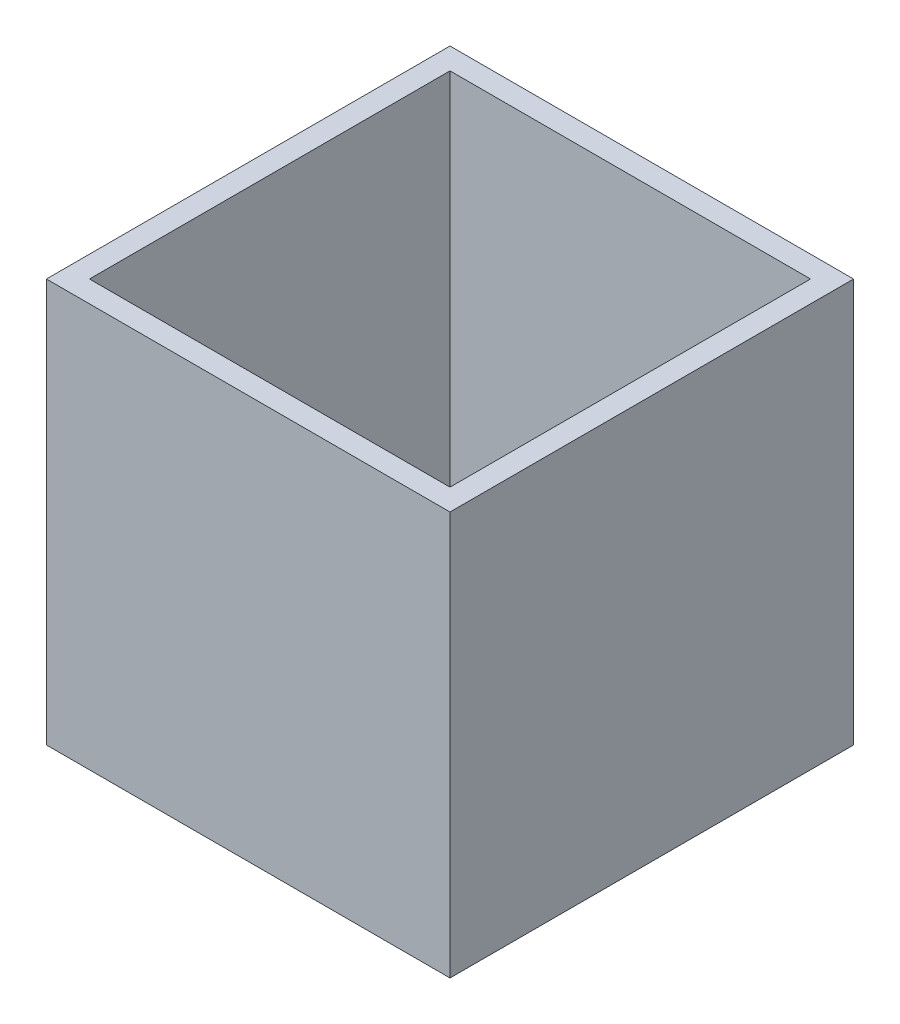
ISO-10303-21;
HEADER;
FILE_DESCRIPTION(('STEP AP214'),'2;1');
FILE_NAME('part.step','',(''),(''),'','','');
FILE_SCHEMA(('AUTOMOTIVE_DESIGN { 1 0 10303 214 1 1 1 1 }'));
ENDSEC;
DATA;
#1=APPLICATION_CONTEXT('core data for automotive mechanical design processes');
#2=APPLICATION_PROTOCOL_DEFINITION('international standard','automotive_design',2000,#1);
#3=PRODUCT_CONTEXT('',#1,'mechanical');
#4=PRODUCT('Part','Part','',(#3));
#5=PRODUCT_RELATED_PRODUCT_CATEGORY('part','',(#4));
#6=PRODUCT_DEFINITION_FORMATION('','',#4);
#7=PRODUCT_DEFINITION_CONTEXT('part definition',#1,'design');
#8=PRODUCT_DEFINITION('design','',#6,#7);
#9=PRODUCT_DEFINITION_SHAPE('','',#8);
#10=(LENGTH_UNIT() NAMED_UNIT(*) SI_UNIT(.MILLI.,.METRE.));
#11=(NAMED_UNIT(*) PLANE_ANGLE_UNIT() SI_UNIT($,.RADIAN.));
#12=(NAMED_UNIT(*) SI_UNIT($,.STERADIAN.) SOLID_ANGLE_UNIT());
#13=UNCERTAINTY_MEASURE_WITH_UNIT(LENGTH_MEASURE(1.E-05),#10,'distance_accuracy_value','');
#14=(GEOMETRIC_REPRESENTATION_CONTEXT(3) GLOBAL_UNCERTAINTY_ASSIGNED_CONTEXT((#13)) GLOBAL_UNIT_ASSIGNED_CONTEXT((#10,
#11,#12)) REPRESENTATION_CONTEXT('',''));
#15=CARTESIAN_POINT('',(0.,0.,0.));
#16=DIRECTION('',(0.,0.,1.));
#17=DIRECTION('',(1.,0.,0.));
#18=AXIS2_PLACEMENT_3D('',#15,#16,#17);
#19=CARTESIAN_POINT('',(0.,150.,0.));
#20=DIRECTION('',(1.,0.,0.));
#21=DIRECTION('',(0.,0.,-1.));
#22=AXIS2_PLACEMENT_3D('',#19,#20,#21);
#23=PLANE('',#22);
#24=DIRECTION('',(0.,0.,1.));
#25=VECTOR('',#24,1.);
#26=CARTESIAN_POINT('',(0.,0.,0.));
#27=LINE('',#26,#25);
#28=CARTESIAN_POINT('',(0.,0.,-150.));
#29=VERTEX_POINT('',#28);
#30=CARTESIAN_POINT('',(0.,0.,0.));
#31=VERTEX_POINT('',#30);
#32=EDGE_CURVE('E166',#29,#31,#27,.T.);
#33=ORIENTED_EDGE('',*,*,#32,.T.);
#34=DIRECTION('',(0.,-1.,0.));
#35=VECTOR('',#34,1.);
#36=CARTESIAN_POINT('',(0.,150.,0.));
#37=LINE('',#36,#35);
#38=CARTESIAN_POINT('',(0.,150.,0.));
#39=VERTEX_POINT('',#38);
#40=EDGE_CURVE('E12',#39,#31,#37,.T.);
#41=ORIENTED_EDGE('',*,*,#40,.F.);
#42=DIRECTION('',(0.,0.,1.));
#43=VECTOR('',#42,1.);
#44=CARTESIAN_POINT('',(0.,150.,0.));
#45=LINE('',#44,#43);
#46=CARTESIAN_POINT('',(0.,150.,-150.));
#47=VERTEX_POINT('',#46);
#48=EDGE_CURVE('E167',#47,#39,#45,.T.);
#49=ORIENTED_EDGE('',*,*,#48,.F.);
#50=DIRECTION('',(0.,-1.,0.));
#51=VECTOR('',#50,1.);
#52=CARTESIAN_POINT('',(0.,150.,-150.));
#53=LINE('',#52,#51);
#54=EDGE_CURVE('E177',#47,#29,#53,.T.);
#55=ORIENTED_EDGE('',*,*,#54,.T.);
#56=EDGE_LOOP('',(#33,#41,#49,#55));
#57=FACE_BOUND('',#56,.T.);
#58=ADVANCED_FACE('F45',(#57),#23,.F.);
#59=CARTESIAN_POINT('',(0.,150.,0.));
#60=DIRECTION('',(0.,0.,-1.));
#61=DIRECTION('',(-1.,0.,0.));
#62=AXIS2_PLACEMENT_3D('',#59,#60,#61);
#63=PLANE('',#62);
#64=DIRECTION('',(1.,0.,0.));
#65=VECTOR('',#64,1.);
#66=CARTESIAN_POINT('',(0.,0.,0.));
#67=LINE('',#66,#65);
#68=CARTESIAN_POINT('',(150.,0.,0.));
#69=VERTEX_POINT('',#68);
#70=EDGE_CURVE('E181',#31,#69,#67,.T.);
#71=ORIENTED_EDGE('',*,*,#70,.T.);
#72=DIRECTION('',(0.,-1.,0.));
#73=VECTOR('',#72,1.);
#74=CARTESIAN_POINT('',(150.,150.,0.));
#75=LINE('',#74,#73);
#76=CARTESIAN_POINT('',(150.,150.,0.));
#77=VERTEX_POINT('',#76);
#78=EDGE_CURVE('E53',#77,#69,#75,.T.);
#79=ORIENTED_EDGE('',*,*,#78,.F.);
#80=DIRECTION('',(1.,0.,0.));
#81=VECTOR('',#80,1.);
#82=CARTESIAN_POINT('',(0.,150.,0.));
#83=LINE('',#82,#81);
#84=EDGE_CURVE('E97',#39,#77,#83,.T.);
#85=ORIENTED_EDGE('',*,*,#84,.F.);
#86=ORIENTED_EDGE('',*,*,#40,.T.);
#87=EDGE_LOOP('',(#71,#79,#85,#86));
#88=FACE_BOUND('',#87,.T.);
#89=ADVANCED_FACE('F216',(#88),#63,.F.);
#90=CARTESIAN_POINT('',(150.,150.,0.));
#91=DIRECTION('',(-1.,0.,0.));
#92=DIRECTION('',(0.,0.,1.));
#93=AXIS2_PLACEMENT_3D('',#90,#91,#92);
#94=PLANE('',#93);
#95=DIRECTION('',(0.,0.,-1.));
#96=VECTOR('',#95,1.);
#97=CARTESIAN_POINT('',(150.,0.,0.));
#98=LINE('',#97,#96);
#99=CARTESIAN_POINT('',(150.,0.,-150.));
#100=VERTEX_POINT('',#99);
#101=EDGE_CURVE('E184',#69,#100,#98,.T.);
#102=ORIENTED_EDGE('',*,*,#101,.T.);
#103=DIRECTION('',(0.,-1.,0.));
#104=VECTOR('',#103,1.);
#105=CARTESIAN_POINT('',(150.,150.,-150.));
#106=LINE('',#105,#104);
#107=CARTESIAN_POINT('',(150.,150.,-150.));
#108=VERTEX_POINT('',#107);
#109=EDGE_CURVE('E191',#108,#100,#106,.T.);
#110=ORIENTED_EDGE('',*,*,#109,.F.);
#111=DIRECTION('',(0.,0.,-1.));
#112=VECTOR('',#111,1.);
#113=CARTESIAN_POINT('',(150.,150.,0.));
#114=LINE('',#113,#112);
#115=EDGE_CURVE('E172',#77,#108,#114,.T.);
#116=ORIENTED_EDGE('',*,*,#115,.F.);
#117=ORIENTED_EDGE('',*,*,#78,.T.);
#118=EDGE_LOOP('',(#102,#110,#116,#117));
#119=FACE_BOUND('',#118,.T.);
#120=ADVANCED_FACE('F198',(#119),#94,.F.);
#121=CARTESIAN_POINT('',(0.,150.,-150.));
#122=DIRECTION('',(0.,0.,1.));
#123=DIRECTION('',(1.,0.,0.));
#124=AXIS2_PLACEMENT_3D('',#121,#122,#123);
#125=PLANE('',#124);
#126=DIRECTION('',(-1.,0.,0.));
#127=VECTOR('',#126,1.);
#128=CARTESIAN_POINT('',(0.,0.,-150.));
#129=LINE('',#128,#127);
#130=EDGE_CURVE('E90',#100,#29,#129,.T.);
#131=ORIENTED_EDGE('',*,*,#130,.T.);
#132=ORIENTED_EDGE('',*,*,#54,.F.);
#133=DIRECTION('',(-1.,0.,0.));
#134=VECTOR('',#133,1.);
#135=CARTESIAN_POINT('',(0.,150.,-150.));
#136=LINE('',#135,#134);
#137=EDGE_CURVE('E69',#108,#47,#136,.T.);
#138=ORIENTED_EDGE('',*,*,#137,.F.);
#139=ORIENTED_EDGE('',*,*,#109,.T.);
#140=EDGE_LOOP('',(#131,#132,#138,#139));
#141=FACE_BOUND('',#140,.T.);
#142=ADVANCED_FACE('F206',(#141),#125,.F.);
#143=CARTESIAN_POINT('',(0.,150.,0.));
#144=DIRECTION('',(0.,-1.,0.));
#145=DIRECTION('',(0.,0.,-1.));
#146=AXIS2_PLACEMENT_3D('',#143,#144,#145);
#147=PLANE('',#146);
#148=DIRECTION('',(0.,0.,-1.));
#149=VECTOR('',#148,1.);
#150=CARTESIAN_POINT('',(142.,150.,-142.));
#151=LINE('',#150,#149);
#152=CARTESIAN_POINT('',(142.,150.,-7.99999999999999));
#153=VERTEX_POINT('',#152);
#154=CARTESIAN_POINT('',(142.,150.,-142.));
#155=VERTEX_POINT('',#154);
#156=EDGE_CURVE('E147',#153,#155,#151,.T.);
#157=ORIENTED_EDGE('',*,*,#156,.F.);
#158=DIRECTION('',(1.,0.,0.));
#159=VECTOR('',#158,1.);
#160=CARTESIAN_POINT('',(142.,150.,-7.99999999999999));
#161=LINE('',#160,#159);
#162=CARTESIAN_POINT('',(7.99999999999995,150.,-7.99999999999999));
#163=VERTEX_POINT('',#162);
#164=EDGE_CURVE('E137',#163,#153,#161,.T.);
#165=ORIENTED_EDGE('',*,*,#164,.F.);
#166=DIRECTION('',(0.,0.,1.));
#167=VECTOR('',#166,1.);
#168=CARTESIAN_POINT('',(7.99999999999998,150.,-142.));
#169=LINE('',#168,#167);
#170=CARTESIAN_POINT('',(7.99999999999998,150.,-142.));
#171=VERTEX_POINT('',#170);
#172=EDGE_CURVE('E151',#171,#163,#169,.T.);
#173=ORIENTED_EDGE('',*,*,#172,.F.);
#174=DIRECTION('',(-1.,0.,0.));
#175=VECTOR('',#174,1.);
#176=CARTESIAN_POINT('',(142.,150.,-142.));
#177=LINE('',#176,#175);
#178=EDGE_CURVE('E60',#155,#171,#177,.T.);
#179=ORIENTED_EDGE('',*,*,#178,.F.);
#180=EDGE_LOOP('',(#157,#165,#173,#179));
#181=FACE_BOUND('',#180,.T.);
#182=ORIENTED_EDGE('',*,*,#48,.T.);
#183=ORIENTED_EDGE('',*,*,#84,.T.);
#184=ORIENTED_EDGE('',*,*,#115,.T.);
#185=ORIENTED_EDGE('',*,*,#137,.T.);
#186=EDGE_LOOP('',(#182,#183,#184,#185));
#187=FACE_BOUND('',#186,.T.);
#188=ADVANCED_FACE('F208',(#181,#187),#147,.F.);
#189=CARTESIAN_POINT('',(0.,0.,0.));
#190=DIRECTION('',(0.,-1.,0.));
#191=DIRECTION('',(0.,0.,-1.));
#192=AXIS2_PLACEMENT_3D('',#189,#190,#191);
#193=PLANE('',#192);
#194=ORIENTED_EDGE('',*,*,#32,.F.);
#195=ORIENTED_EDGE('',*,*,#130,.F.);
#196=ORIENTED_EDGE('',*,*,#101,.F.);
#197=ORIENTED_EDGE('',*,*,#70,.F.);
#198=EDGE_LOOP('',(#194,#195,#196,#197));
#199=FACE_BOUND('',#198,.T.);
#200=ADVANCED_FACE('F202',(#199),#193,.T.);
#201=CARTESIAN_POINT('',(0.,8.00000000000001,0.));
#202=DIRECTION('',(0.,-1.,0.));
#203=DIRECTION('',(0.,0.,-1.));
#204=AXIS2_PLACEMENT_3D('',#201,#202,#203);
#205=PLANE('',#204);
#206=DIRECTION('',(0.,0.,1.));
#207=VECTOR('',#206,1.);
#208=CARTESIAN_POINT('',(7.99999999999998,8.00000000000001,-142.));
#209=LINE('',#208,#207);
#210=CARTESIAN_POINT('',(7.99999999999998,8.00000000000001,-142.));
#211=VERTEX_POINT('',#210);
#212=CARTESIAN_POINT('',(7.99999999999995,8.00000000000001,-7.99999999999999));
#213=VERTEX_POINT('',#212);
#214=EDGE_CURVE('E142',#211,#213,#209,.T.);
#215=ORIENTED_EDGE('',*,*,#214,.T.);
#216=DIRECTION('',(1.,0.,0.));
#217=VECTOR('',#216,1.);
#218=CARTESIAN_POINT('',(142.,8.00000000000001,-7.99999999999999));
#219=LINE('',#218,#217);
#220=CARTESIAN_POINT('',(142.,7.9999999999999,-7.99999999999999));
#221=VERTEX_POINT('',#220);
#222=EDGE_CURVE('E134',#213,#221,#219,.T.);
#223=ORIENTED_EDGE('',*,*,#222,.T.);
#224=DIRECTION('',(0.,0.,-1.));
#225=VECTOR('',#224,1.);
#226=CARTESIAN_POINT('',(142.,8.00000000000001,-142.));
#227=LINE('',#226,#225);
#228=CARTESIAN_POINT('',(142.,8.00000000000001,-142.));
#229=VERTEX_POINT('',#228);
#230=EDGE_CURVE('E120',#221,#229,#227,.T.);
#231=ORIENTED_EDGE('',*,*,#230,.T.);
#232=DIRECTION('',(-1.,0.,0.));
#233=VECTOR('',#232,1.);
#234=CARTESIAN_POINT('',(142.,8.00000000000001,-142.));
#235=LINE('',#234,#233);
#236=EDGE_CURVE('E157',#229,#211,#235,.T.);
#237=ORIENTED_EDGE('',*,*,#236,.T.);
#238=EDGE_LOOP('',(#215,#223,#231,#237));
#239=FACE_BOUND('',#238,.T.);
#240=ADVANCED_FACE('F141',(#239),#205,.F.);
#241=CARTESIAN_POINT('',(142.,-323.504617357995,-7.99999999999999));
#242=DIRECTION('',(0.,0.,1.));
#243=DIRECTION('',(1.,0.,0.));
#244=AXIS2_PLACEMENT_3D('',#241,#242,#243);
#245=PLANE('',#244);
#246=DIRECTION('',(0.,1.,0.));
#247=VECTOR('',#246,1.);
#248=CARTESIAN_POINT('',(7.99999999999995,-323.504617357995,-7.99999999999999));
#249=LINE('',#248,#247);
#250=EDGE_CURVE('E155',#213,#163,#249,.T.);
#251=ORIENTED_EDGE('',*,*,#250,.T.);
#252=ORIENTED_EDGE('',*,*,#164,.T.);
#253=DIRECTION('',(0.,1.,0.));
#254=VECTOR('',#253,1.);
#255=CARTESIAN_POINT('',(142.,-323.504617357995,-7.99999999999999));
#256=LINE('',#255,#254);
#257=EDGE_CURVE('E124',#221,#153,#256,.T.);
#258=ORIENTED_EDGE('',*,*,#257,.F.);
#259=ORIENTED_EDGE('',*,*,#222,.F.);
#260=EDGE_LOOP('',(#251,#252,#258,#259));
#261=FACE_BOUND('',#260,.T.);
#262=ADVANCED_FACE('F133',(#261),#245,.F.);
#263=CARTESIAN_POINT('',(142.,-323.504617357995,-142.));
#264=DIRECTION('',(1.,0.,0.));
#265=DIRECTION('',(0.,0.,-1.));
#266=AXIS2_PLACEMENT_3D('',#263,#264,#265);
#267=PLANE('',#266);
#268=ORIENTED_EDGE('',*,*,#257,.T.);
#269=ORIENTED_EDGE('',*,*,#156,.T.);
#270=DIRECTION('',(0.,1.,0.));
#271=VECTOR('',#270,1.);
#272=CARTESIAN_POINT('',(142.,-323.504617357995,-142.));
#273=LINE('',#272,#271);
#274=EDGE_CURVE('E126',#229,#155,#273,.T.);
#275=ORIENTED_EDGE('',*,*,#274,.F.);
#276=ORIENTED_EDGE('',*,*,#230,.F.);
#277=EDGE_LOOP('',(#268,#269,#275,#276));
#278=FACE_BOUND('',#277,.T.);
#279=ADVANCED_FACE('F122',(#278),#267,.F.);
#280=CARTESIAN_POINT('',(142.,-323.504617357995,-142.));
#281=DIRECTION('',(0.,0.,-1.));
#282=DIRECTION('',(-1.,0.,0.));
#283=AXIS2_PLACEMENT_3D('',#280,#281,#282);
#284=PLANE('',#283);
#285=ORIENTED_EDGE('',*,*,#274,.T.);
#286=ORIENTED_EDGE('',*,*,#178,.T.);
#287=DIRECTION('',(0.,1.,0.));
#288=VECTOR('',#287,1.);
#289=CARTESIAN_POINT('',(7.99999999999998,-323.504617357995,-142.));
#290=LINE('',#289,#288);
#291=EDGE_CURVE('E156',#211,#171,#290,.T.);
#292=ORIENTED_EDGE('',*,*,#291,.F.);
#293=ORIENTED_EDGE('',*,*,#236,.F.);
#294=EDGE_LOOP('',(#285,#286,#292,#293));
#295=FACE_BOUND('',#294,.T.);
#296=ADVANCED_FACE('F277',(#295),#284,.F.);
#297=CARTESIAN_POINT('',(7.99999999999998,-323.504617357995,-142.));
#298=DIRECTION('',(-1.,0.,0.));
#299=DIRECTION('',(0.,0.,1.));
#300=AXIS2_PLACEMENT_3D('',#297,#298,#299);
#301=PLANE('',#300);
#302=ORIENTED_EDGE('',*,*,#291,.T.);
#303=ORIENTED_EDGE('',*,*,#172,.T.);
#304=ORIENTED_EDGE('',*,*,#250,.F.);
#305=ORIENTED_EDGE('',*,*,#214,.F.);
#306=EDGE_LOOP('',(#302,#303,#304,#305));
#307=FACE_BOUND('',#306,.T.);
#308=ADVANCED_FACE('F287',(#307),#301,.F.);
#309=CLOSED_SHELL('',(#58,#89,#120,#142,#188,#200,#240,#262,#279,#296,#308));
#310=MANIFOLD_SOLID_BREP('B2',#309);
#311=ADVANCED_BREP_SHAPE_REPRESENTATION('',(#18,#310),#14);
#312=SHAPE_DEFINITION_REPRESENTATION(#9,#311);
ENDSEC;
END-ISO-10303-21;
